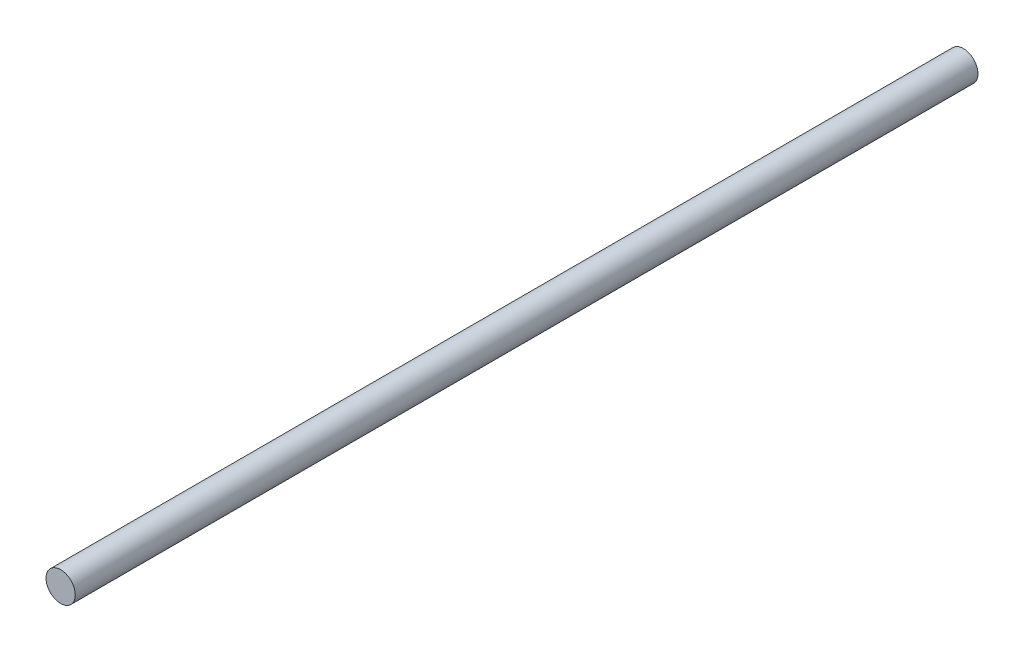
ISO-10303-21;
HEADER;
FILE_DESCRIPTION(('STEP AP214'),'2;1');
FILE_NAME('part.step','',(''),(''),'','','');
FILE_SCHEMA(('AUTOMOTIVE_DESIGN { 1 0 10303 214 1 1 1 1 }'));
ENDSEC;
DATA;
#1=APPLICATION_CONTEXT('core data for automotive mechanical design processes');
#2=APPLICATION_PROTOCOL_DEFINITION('international standard','automotive_design',2000,#1);
#3=PRODUCT_CONTEXT('',#1,'mechanical');
#4=PRODUCT('Part','Part','',(#3));
#5=PRODUCT_RELATED_PRODUCT_CATEGORY('part','',(#4));
#6=PRODUCT_DEFINITION_FORMATION('','',#4);
#7=PRODUCT_DEFINITION_CONTEXT('part definition',#1,'design');
#8=PRODUCT_DEFINITION('design','',#6,#7);
#9=PRODUCT_DEFINITION_SHAPE('','',#8);
#10=(LENGTH_UNIT() NAMED_UNIT(*) SI_UNIT(.MILLI.,.METRE.));
#11=(NAMED_UNIT(*) PLANE_ANGLE_UNIT() SI_UNIT($,.RADIAN.));
#12=(NAMED_UNIT(*) SI_UNIT($,.STERADIAN.) SOLID_ANGLE_UNIT());
#13=UNCERTAINTY_MEASURE_WITH_UNIT(LENGTH_MEASURE(1.E-05),#10,'distance_accuracy_value','');
#14=(GEOMETRIC_REPRESENTATION_CONTEXT(3) GLOBAL_UNCERTAINTY_ASSIGNED_CONTEXT((#13)) GLOBAL_UNIT_ASSIGNED_CONTEXT((#10,
#11,#12)) REPRESENTATION_CONTEXT('',''));
#15=CARTESIAN_POINT('',(0.,0.,0.));
#16=DIRECTION('',(0.,0.,1.));
#17=DIRECTION('',(1.,0.,0.));
#18=AXIS2_PLACEMENT_3D('',#15,#16,#17);
#19=CARTESIAN_POINT('',(0.,0.,49.3139206606353));
#20=DIRECTION('',(0.,0.,1.));
#21=DIRECTION('',(1.,0.,0.));
#22=AXIS2_PLACEMENT_3D('',#19,#20,#21);
#23=PLANE('',#22);
#24=CARTESIAN_POINT('',(0.,0.,49.3139206606353));
#25=DIRECTION('',(0.,0.,-1.));
#26=DIRECTION('',(-1.,0.,0.));
#27=AXIS2_PLACEMENT_3D('',#24,#25,#26);
#28=CIRCLE('',#27,1.6);
#29=CARTESIAN_POINT('',(-1.6,0.,49.3139206606353));
#30=VERTEX_POINT('',#29);
#31=EDGE_CURVE('E9',#30,#30,#28,.T.);
#32=ORIENTED_EDGE('',*,*,#31,.F.);
#33=EDGE_LOOP('',(#32));
#34=FACE_BOUND('',#33,.T.);
#35=ADVANCED_FACE('F14',(#34),#23,.T.);
#36=CARTESIAN_POINT('',(0.,0.,-49.3139206606353));
#37=DIRECTION('',(0.,0.,-1.));
#38=DIRECTION('',(-1.,0.,0.));
#39=AXIS2_PLACEMENT_3D('',#36,#37,#38);
#40=PLANE('',#39);
#41=CARTESIAN_POINT('',(0.,0.,-49.3139206606353));
#42=DIRECTION('',(0.,0.,1.));
#43=DIRECTION('',(1.,0.,0.));
#44=AXIS2_PLACEMENT_3D('',#41,#42,#43);
#45=CIRCLE('',#44,1.6);
#46=CARTESIAN_POINT('',(1.6,0.,-49.3139206606353));
#47=VERTEX_POINT('',#46);
#48=EDGE_CURVE('E21',#47,#47,#45,.T.);
#49=ORIENTED_EDGE('',*,*,#48,.F.);
#50=EDGE_LOOP('',(#49));
#51=FACE_BOUND('',#50,.T.);
#52=ADVANCED_FACE('F29',(#51),#40,.T.);
#53=CARTESIAN_POINT('',(0.,0.,-49.3139206606353));
#54=DIRECTION('',(0.,0.,1.));
#55=DIRECTION('',(1.,0.,0.));
#56=AXIS2_PLACEMENT_3D('',#53,#54,#55);
#57=CYLINDRICAL_SURFACE('',#56,1.6);
#58=ORIENTED_EDGE('',*,*,#31,.T.);
#59=EDGE_LOOP('',(#58));
#60=FACE_BOUND('',#59,.T.);
#61=ORIENTED_EDGE('',*,*,#48,.T.);
#62=EDGE_LOOP('',(#61));
#63=FACE_BOUND('',#62,.T.);
#64=ADVANCED_FACE('F16',(#60,#63),#57,.T.);
#65=CLOSED_SHELL('',(#35,#52,#64));
#66=MANIFOLD_SOLID_BREP('B1',#65);
#67=ADVANCED_BREP_SHAPE_REPRESENTATION('',(#18,#66),#14);
#68=SHAPE_DEFINITION_REPRESENTATION(#9,#67);
ENDSEC;
END-ISO-10303-21;
